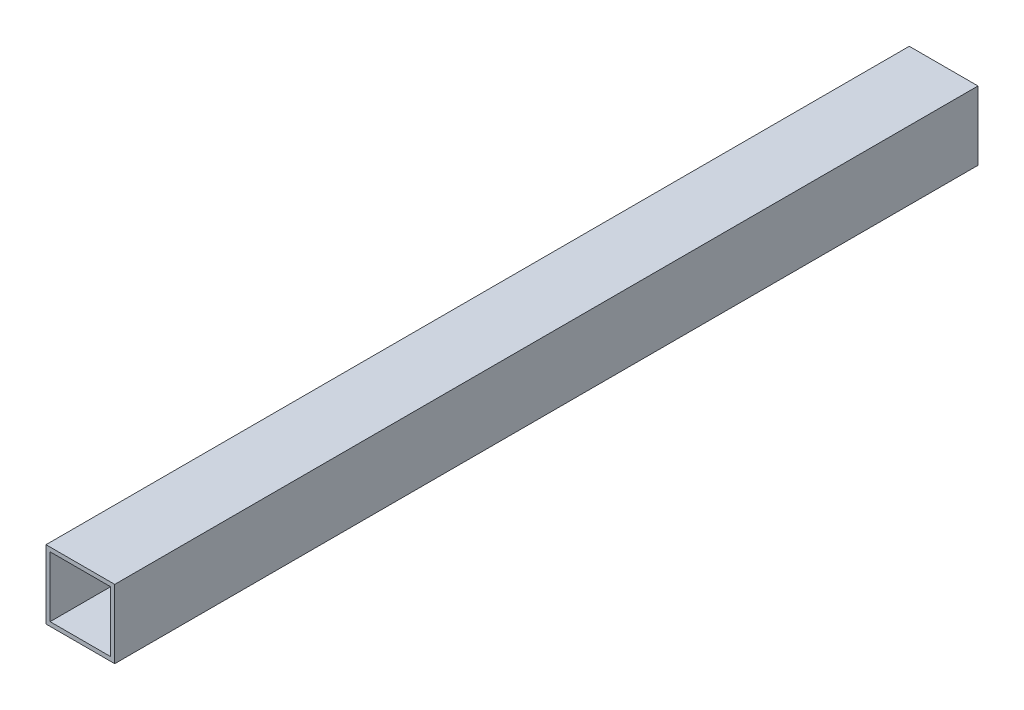
ISO-10303-21;
HEADER;
FILE_DESCRIPTION(('STEP AP214'),'2;1');
FILE_NAME('part.step','',(''),(''),'','','');
FILE_SCHEMA(('AUTOMOTIVE_DESIGN { 1 0 10303 214 1 1 1 1 }'));
ENDSEC;
DATA;
#1=APPLICATION_CONTEXT('core data for automotive mechanical design processes');
#2=APPLICATION_PROTOCOL_DEFINITION('international standard','automotive_design',2000,#1);
#3=PRODUCT_CONTEXT('',#1,'mechanical');
#4=PRODUCT('Part','Part','',(#3));
#5=PRODUCT_RELATED_PRODUCT_CATEGORY('part','',(#4));
#6=PRODUCT_DEFINITION_FORMATION('','',#4);
#7=PRODUCT_DEFINITION_CONTEXT('part definition',#1,'design');
#8=PRODUCT_DEFINITION('design','',#6,#7);
#9=PRODUCT_DEFINITION_SHAPE('','',#8);
#10=(LENGTH_UNIT() NAMED_UNIT(*) SI_UNIT(.MILLI.,.METRE.));
#11=(NAMED_UNIT(*) PLANE_ANGLE_UNIT() SI_UNIT($,.RADIAN.));
#12=(NAMED_UNIT(*) SI_UNIT($,.STERADIAN.) SOLID_ANGLE_UNIT());
#13=UNCERTAINTY_MEASURE_WITH_UNIT(LENGTH_MEASURE(1.E-05),#10,'distance_accuracy_value','');
#14=(GEOMETRIC_REPRESENTATION_CONTEXT(3) GLOBAL_UNCERTAINTY_ASSIGNED_CONTEXT((#13)) GLOBAL_UNIT_ASSIGNED_CONTEXT((#10,
#11,#12)) REPRESENTATION_CONTEXT('',''));
#15=CARTESIAN_POINT('',(0.,0.,0.));
#16=DIRECTION('',(0.,0.,1.));
#17=DIRECTION('',(1.,0.,0.));
#18=AXIS2_PLACEMENT_3D('',#15,#16,#17);
#19=CARTESIAN_POINT('',(0.,0.,314.));
#20=DIRECTION('',(0.,0.,1.));
#21=DIRECTION('',(1.,0.,0.));
#22=AXIS2_PLACEMENT_3D('',#19,#20,#21);
#23=PLANE('',#22);
#24=DIRECTION('',(0.,1.,0.));
#25=VECTOR('',#24,1.);
#26=CARTESIAN_POINT('',(12.5,-12.5,314.));
#27=LINE('',#26,#25);
#28=CARTESIAN_POINT('',(12.5,-12.5,314.));
#29=VERTEX_POINT('',#28);
#30=CARTESIAN_POINT('',(12.5,12.5,314.));
#31=VERTEX_POINT('',#30);
#32=EDGE_CURVE('E157',#29,#31,#27,.T.);
#33=ORIENTED_EDGE('',*,*,#32,.T.);
#34=DIRECTION('',(-1.,0.,0.));
#35=VECTOR('',#34,1.);
#36=CARTESIAN_POINT('',(-12.5,12.5,314.));
#37=LINE('',#36,#35);
#38=CARTESIAN_POINT('',(-12.5,12.5,314.));
#39=VERTEX_POINT('',#38);
#40=EDGE_CURVE('E160',#31,#39,#37,.T.);
#41=ORIENTED_EDGE('',*,*,#40,.T.);
#42=DIRECTION('',(0.,-1.,0.));
#43=VECTOR('',#42,1.);
#44=CARTESIAN_POINT('',(-12.5,-12.5,314.));
#45=LINE('',#44,#43);
#46=CARTESIAN_POINT('',(-12.5,-12.5,314.));
#47=VERTEX_POINT('',#46);
#48=EDGE_CURVE('E163',#39,#47,#45,.T.);
#49=ORIENTED_EDGE('',*,*,#48,.T.);
#50=DIRECTION('',(1.,0.,0.));
#51=VECTOR('',#50,1.);
#52=CARTESIAN_POINT('',(-12.5,-12.5,314.));
#53=LINE('',#52,#51);
#54=EDGE_CURVE('E165',#47,#29,#53,.T.);
#55=ORIENTED_EDGE('',*,*,#54,.T.);
#56=EDGE_LOOP('',(#33,#41,#49,#55));
#57=FACE_BOUND('',#56,.T.);
#58=DIRECTION('',(-1.,0.,0.));
#59=VECTOR('',#58,1.);
#60=CARTESIAN_POINT('',(0.,11.,314.));
#61=LINE('',#60,#59);
#62=CARTESIAN_POINT('',(11.,11.,314.));
#63=VERTEX_POINT('',#62);
#64=CARTESIAN_POINT('',(-11.,11.,314.));
#65=VERTEX_POINT('',#64);
#66=EDGE_CURVE('E129',#63,#65,#61,.T.);
#67=ORIENTED_EDGE('',*,*,#66,.F.);
#68=DIRECTION('',(0.,1.,0.));
#69=VECTOR('',#68,1.);
#70=CARTESIAN_POINT('',(11.,0.,314.));
#71=LINE('',#70,#69);
#72=CARTESIAN_POINT('',(11.,-11.,314.));
#73=VERTEX_POINT('',#72);
#74=EDGE_CURVE('E121',#73,#63,#71,.T.);
#75=ORIENTED_EDGE('',*,*,#74,.F.);
#76=DIRECTION('',(1.,0.,0.));
#77=VECTOR('',#76,1.);
#78=CARTESIAN_POINT('',(0.,-11.,314.));
#79=LINE('',#78,#77);
#80=CARTESIAN_POINT('',(-11.,-11.,314.));
#81=VERTEX_POINT('',#80);
#82=EDGE_CURVE('E143',#81,#73,#79,.T.);
#83=ORIENTED_EDGE('',*,*,#82,.F.);
#84=DIRECTION('',(0.,-1.,0.));
#85=VECTOR('',#84,1.);
#86=CARTESIAN_POINT('',(-11.,0.,314.));
#87=LINE('',#86,#85);
#88=EDGE_CURVE('E141',#65,#81,#87,.T.);
#89=ORIENTED_EDGE('',*,*,#88,.F.);
#90=EDGE_LOOP('',(#67,#75,#83,#89));
#91=FACE_BOUND('',#90,.T.);
#92=ADVANCED_FACE('F56',(#57,#91),#23,.T.);
#93=CARTESIAN_POINT('',(0.,0.,0.));
#94=DIRECTION('',(0.,0.,1.));
#95=DIRECTION('',(1.,0.,0.));
#96=AXIS2_PLACEMENT_3D('',#93,#94,#95);
#97=PLANE('',#96);
#98=DIRECTION('',(0.,1.,0.));
#99=VECTOR('',#98,1.);
#100=CARTESIAN_POINT('',(12.5,-12.5,0.));
#101=LINE('',#100,#99);
#102=CARTESIAN_POINT('',(12.5,-12.5,0.));
#103=VERTEX_POINT('',#102);
#104=CARTESIAN_POINT('',(12.5,12.5,0.));
#105=VERTEX_POINT('',#104);
#106=EDGE_CURVE('E137',#103,#105,#101,.T.);
#107=ORIENTED_EDGE('',*,*,#106,.F.);
#108=DIRECTION('',(1.,0.,0.));
#109=VECTOR('',#108,1.);
#110=CARTESIAN_POINT('',(-12.5,-12.5,0.));
#111=LINE('',#110,#109);
#112=CARTESIAN_POINT('',(-12.5,-12.5,0.));
#113=VERTEX_POINT('',#112);
#114=EDGE_CURVE('E161',#113,#103,#111,.T.);
#115=ORIENTED_EDGE('',*,*,#114,.F.);
#116=DIRECTION('',(0.,-1.,0.));
#117=VECTOR('',#116,1.);
#118=CARTESIAN_POINT('',(-12.5,-12.5,0.));
#119=LINE('',#118,#117);
#120=CARTESIAN_POINT('',(-12.5,12.5,0.));
#121=VERTEX_POINT('',#120);
#122=EDGE_CURVE('E172',#121,#113,#119,.T.);
#123=ORIENTED_EDGE('',*,*,#122,.F.);
#124=DIRECTION('',(-1.,0.,0.));
#125=VECTOR('',#124,1.);
#126=CARTESIAN_POINT('',(-12.5,12.5,0.));
#127=LINE('',#126,#125);
#128=EDGE_CURVE('E170',#105,#121,#127,.T.);
#129=ORIENTED_EDGE('',*,*,#128,.F.);
#130=EDGE_LOOP('',(#107,#115,#123,#129));
#131=FACE_BOUND('',#130,.T.);
#132=DIRECTION('',(0.,1.,0.));
#133=VECTOR('',#132,1.);
#134=CARTESIAN_POINT('',(11.,0.,0.));
#135=LINE('',#134,#133);
#136=CARTESIAN_POINT('',(11.,-11.,0.));
#137=VERTEX_POINT('',#136);
#138=CARTESIAN_POINT('',(11.,11.,0.));
#139=VERTEX_POINT('',#138);
#140=EDGE_CURVE('E79',#137,#139,#135,.T.);
#141=ORIENTED_EDGE('',*,*,#140,.T.);
#142=DIRECTION('',(-1.,0.,0.));
#143=VECTOR('',#142,1.);
#144=CARTESIAN_POINT('',(0.,11.,0.));
#145=LINE('',#144,#143);
#146=CARTESIAN_POINT('',(-11.,11.,0.));
#147=VERTEX_POINT('',#146);
#148=EDGE_CURVE('E136',#139,#147,#145,.T.);
#149=ORIENTED_EDGE('',*,*,#148,.T.);
#150=DIRECTION('',(0.,-1.,0.));
#151=VECTOR('',#150,1.);
#152=CARTESIAN_POINT('',(-11.,0.,0.));
#153=LINE('',#152,#151);
#154=CARTESIAN_POINT('',(-11.,-11.,0.));
#155=VERTEX_POINT('',#154);
#156=EDGE_CURVE('E149',#147,#155,#153,.T.);
#157=ORIENTED_EDGE('',*,*,#156,.T.);
#158=DIRECTION('',(1.,0.,0.));
#159=VECTOR('',#158,1.);
#160=CARTESIAN_POINT('',(0.,-11.,0.));
#161=LINE('',#160,#159);
#162=EDGE_CURVE('E130',#155,#137,#161,.T.);
#163=ORIENTED_EDGE('',*,*,#162,.T.);
#164=EDGE_LOOP('',(#141,#149,#157,#163));
#165=FACE_BOUND('',#164,.T.);
#166=ADVANCED_FACE('F190',(#131,#165),#97,.F.);
#167=CARTESIAN_POINT('',(12.5,-12.5,314.));
#168=DIRECTION('',(-1.,0.,0.));
#169=DIRECTION('',(0.,0.,1.));
#170=AXIS2_PLACEMENT_3D('',#167,#168,#169);
#171=PLANE('',#170);
#172=ORIENTED_EDGE('',*,*,#106,.T.);
#173=DIRECTION('',(0.,0.,-1.));
#174=VECTOR('',#173,1.);
#175=CARTESIAN_POINT('',(12.5,12.5,314.));
#176=LINE('',#175,#174);
#177=EDGE_CURVE('E12',#31,#105,#176,.T.);
#178=ORIENTED_EDGE('',*,*,#177,.F.);
#179=ORIENTED_EDGE('',*,*,#32,.F.);
#180=DIRECTION('',(0.,0.,-1.));
#181=VECTOR('',#180,1.);
#182=CARTESIAN_POINT('',(12.5,-12.5,314.));
#183=LINE('',#182,#181);
#184=EDGE_CURVE('E167',#29,#103,#183,.T.);
#185=ORIENTED_EDGE('',*,*,#184,.T.);
#186=EDGE_LOOP('',(#172,#178,#179,#185));
#187=FACE_BOUND('',#186,.T.);
#188=ADVANCED_FACE('F58',(#187),#171,.F.);
#189=CARTESIAN_POINT('',(-12.5,12.5,314.));
#190=DIRECTION('',(0.,-1.,0.));
#191=DIRECTION('',(0.,0.,-1.));
#192=AXIS2_PLACEMENT_3D('',#189,#190,#191);
#193=PLANE('',#192);
#194=ORIENTED_EDGE('',*,*,#128,.T.);
#195=DIRECTION('',(0.,0.,-1.));
#196=VECTOR('',#195,1.);
#197=CARTESIAN_POINT('',(-12.5,12.5,314.));
#198=LINE('',#197,#196);
#199=EDGE_CURVE('E64',#39,#121,#198,.T.);
#200=ORIENTED_EDGE('',*,*,#199,.F.);
#201=ORIENTED_EDGE('',*,*,#40,.F.);
#202=ORIENTED_EDGE('',*,*,#177,.T.);
#203=EDGE_LOOP('',(#194,#200,#201,#202));
#204=FACE_BOUND('',#203,.T.);
#205=ADVANCED_FACE('F200',(#204),#193,.F.);
#206=CARTESIAN_POINT('',(-12.5,-12.5,314.));
#207=DIRECTION('',(1.,0.,0.));
#208=DIRECTION('',(0.,0.,-1.));
#209=AXIS2_PLACEMENT_3D('',#206,#207,#208);
#210=PLANE('',#209);
#211=ORIENTED_EDGE('',*,*,#122,.T.);
#212=DIRECTION('',(0.,0.,-1.));
#213=VECTOR('',#212,1.);
#214=CARTESIAN_POINT('',(-12.5,-12.5,314.));
#215=LINE('',#214,#213);
#216=EDGE_CURVE('E177',#47,#113,#215,.T.);
#217=ORIENTED_EDGE('',*,*,#216,.F.);
#218=ORIENTED_EDGE('',*,*,#48,.F.);
#219=ORIENTED_EDGE('',*,*,#199,.T.);
#220=EDGE_LOOP('',(#211,#217,#218,#219));
#221=FACE_BOUND('',#220,.T.);
#222=ADVANCED_FACE('F184',(#221),#210,.F.);
#223=CARTESIAN_POINT('',(-12.5,-12.5,314.));
#224=DIRECTION('',(0.,1.,0.));
#225=DIRECTION('',(0.,0.,1.));
#226=AXIS2_PLACEMENT_3D('',#223,#224,#225);
#227=PLANE('',#226);
#228=ORIENTED_EDGE('',*,*,#114,.T.);
#229=ORIENTED_EDGE('',*,*,#184,.F.);
#230=ORIENTED_EDGE('',*,*,#54,.F.);
#231=ORIENTED_EDGE('',*,*,#216,.T.);
#232=EDGE_LOOP('',(#228,#229,#230,#231));
#233=FACE_BOUND('',#232,.T.);
#234=ADVANCED_FACE('F194',(#233),#227,.F.);
#235=CARTESIAN_POINT('',(11.,0.,314.));
#236=DIRECTION('',(-1.,0.,0.));
#237=DIRECTION('',(0.,0.,1.));
#238=AXIS2_PLACEMENT_3D('',#235,#236,#237);
#239=PLANE('',#238);
#240=ORIENTED_EDGE('',*,*,#140,.F.);
#241=DIRECTION('',(0.,0.,-1.));
#242=VECTOR('',#241,1.);
#243=CARTESIAN_POINT('',(11.,-11.,314.));
#244=LINE('',#243,#242);
#245=EDGE_CURVE('E125',#73,#137,#244,.T.);
#246=ORIENTED_EDGE('',*,*,#245,.F.);
#247=ORIENTED_EDGE('',*,*,#74,.T.);
#248=DIRECTION('',(0.,0.,-1.));
#249=VECTOR('',#248,1.);
#250=CARTESIAN_POINT('',(11.,11.,314.));
#251=LINE('',#250,#249);
#252=EDGE_CURVE('E124',#63,#139,#251,.T.);
#253=ORIENTED_EDGE('',*,*,#252,.T.);
#254=EDGE_LOOP('',(#240,#246,#247,#253));
#255=FACE_BOUND('',#254,.T.);
#256=ADVANCED_FACE('F123',(#255),#239,.T.);
#257=CARTESIAN_POINT('',(0.,11.,314.));
#258=DIRECTION('',(0.,-1.,0.));
#259=DIRECTION('',(0.,0.,-1.));
#260=AXIS2_PLACEMENT_3D('',#257,#258,#259);
#261=PLANE('',#260);
#262=ORIENTED_EDGE('',*,*,#148,.F.);
#263=ORIENTED_EDGE('',*,*,#252,.F.);
#264=ORIENTED_EDGE('',*,*,#66,.T.);
#265=DIRECTION('',(0.,0.,-1.));
#266=VECTOR('',#265,1.);
#267=CARTESIAN_POINT('',(-11.,11.,314.));
#268=LINE('',#267,#266);
#269=EDGE_CURVE('E138',#65,#147,#268,.T.);
#270=ORIENTED_EDGE('',*,*,#269,.T.);
#271=EDGE_LOOP('',(#262,#263,#264,#270));
#272=FACE_BOUND('',#271,.T.);
#273=ADVANCED_FACE('F133',(#272),#261,.T.);
#274=CARTESIAN_POINT('',(-11.,0.,314.));
#275=DIRECTION('',(1.,0.,0.));
#276=DIRECTION('',(0.,0.,-1.));
#277=AXIS2_PLACEMENT_3D('',#274,#275,#276);
#278=PLANE('',#277);
#279=ORIENTED_EDGE('',*,*,#156,.F.);
#280=ORIENTED_EDGE('',*,*,#269,.F.);
#281=ORIENTED_EDGE('',*,*,#88,.T.);
#282=DIRECTION('',(0.,0.,-1.));
#283=VECTOR('',#282,1.);
#284=CARTESIAN_POINT('',(-11.,-11.,314.));
#285=LINE('',#284,#283);
#286=EDGE_CURVE('E71',#81,#155,#285,.T.);
#287=ORIENTED_EDGE('',*,*,#286,.T.);
#288=EDGE_LOOP('',(#279,#280,#281,#287));
#289=FACE_BOUND('',#288,.T.);
#290=ADVANCED_FACE('F223',(#289),#278,.T.);
#291=CARTESIAN_POINT('',(0.,-11.,314.));
#292=DIRECTION('',(0.,1.,0.));
#293=DIRECTION('',(0.,0.,1.));
#294=AXIS2_PLACEMENT_3D('',#291,#292,#293);
#295=PLANE('',#294);
#296=ORIENTED_EDGE('',*,*,#162,.F.);
#297=ORIENTED_EDGE('',*,*,#286,.F.);
#298=ORIENTED_EDGE('',*,*,#82,.T.);
#299=ORIENTED_EDGE('',*,*,#245,.T.);
#300=EDGE_LOOP('',(#296,#297,#298,#299));
#301=FACE_BOUND('',#300,.T.);
#302=ADVANCED_FACE('F227',(#301),#295,.T.);
#303=CLOSED_SHELL('',(#92,#166,#188,#205,#222,#234,#256,#273,#290,#302));
#304=MANIFOLD_SOLID_BREP('B2',#303);
#305=ADVANCED_BREP_SHAPE_REPRESENTATION('',(#18,#304),#14);
#306=SHAPE_DEFINITION_REPRESENTATION(#9,#305);
ENDSEC;
END-ISO-10303-21;
